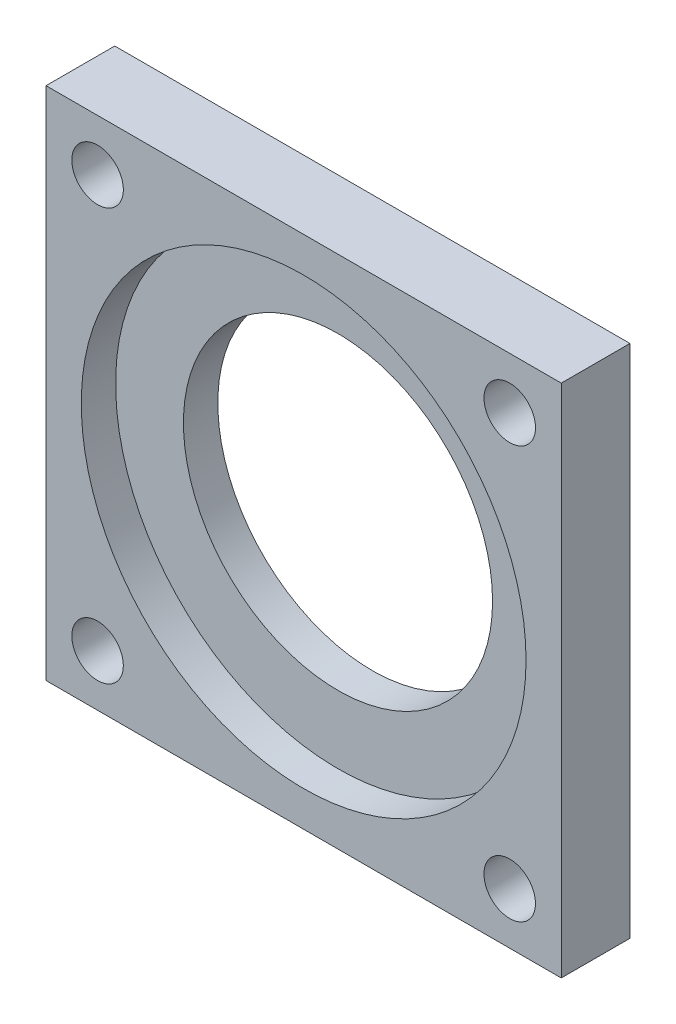
ISO-10303-21;
HEADER;
FILE_DESCRIPTION(('STEP AP214'),'2;1');
FILE_NAME('part.step','',(''),(''),'','','');
FILE_SCHEMA(('AUTOMOTIVE_DESIGN { 1 0 10303 214 1 1 1 1 }'));
ENDSEC;
DATA;
#1=APPLICATION_CONTEXT('core data for automotive mechanical design processes');
#2=APPLICATION_PROTOCOL_DEFINITION('international standard','automotive_design',2000,#1);
#3=PRODUCT_CONTEXT('',#1,'mechanical');
#4=PRODUCT('Part','Part','',(#3));
#5=PRODUCT_RELATED_PRODUCT_CATEGORY('part','',(#4));
#6=PRODUCT_DEFINITION_FORMATION('','',#4);
#7=PRODUCT_DEFINITION_CONTEXT('part definition',#1,'design');
#8=PRODUCT_DEFINITION('design','',#6,#7);
#9=PRODUCT_DEFINITION_SHAPE('','',#8);
#10=(LENGTH_UNIT() NAMED_UNIT(*) SI_UNIT(.MILLI.,.METRE.));
#11=(NAMED_UNIT(*) PLANE_ANGLE_UNIT() SI_UNIT($,.RADIAN.));
#12=(NAMED_UNIT(*) SI_UNIT($,.STERADIAN.) SOLID_ANGLE_UNIT());
#13=UNCERTAINTY_MEASURE_WITH_UNIT(LENGTH_MEASURE(1.E-05),#10,'distance_accuracy_value','');
#14=(GEOMETRIC_REPRESENTATION_CONTEXT(3) GLOBAL_UNCERTAINTY_ASSIGNED_CONTEXT((#13)) GLOBAL_UNIT_ASSIGNED_CONTEXT((#10,
#11,#12)) REPRESENTATION_CONTEXT('',''));
#15=CARTESIAN_POINT('',(0.,0.,0.));
#16=DIRECTION('',(0.,0.,1.));
#17=DIRECTION('',(1.,0.,0.));
#18=AXIS2_PLACEMENT_3D('',#15,#16,#17);
#19=CARTESIAN_POINT('',(0.,0.,-0.00100000000000013));
#20=DIRECTION('',(0.,0.,1.));
#21=DIRECTION('',(1.,0.,0.));
#22=AXIS2_PLACEMENT_3D('',#19,#20,#21);
#23=CYLINDRICAL_SURFACE('',#22,9.);
#24=CARTESIAN_POINT('',(0.,0.,0.));
#25=DIRECTION('',(0.,0.,1.));
#26=DIRECTION('',(1.,0.,0.));
#27=AXIS2_PLACEMENT_3D('',#24,#25,#26);
#28=CIRCLE('',#27,9.);
#29=CARTESIAN_POINT('',(9.,0.,0.));
#30=VERTEX_POINT('',#29);
#31=EDGE_CURVE('E135',#30,#30,#28,.F.);
#32=ORIENTED_EDGE('',*,*,#31,.T.);
#33=EDGE_LOOP('',(#32));
#34=FACE_BOUND('',#33,.T.);
#35=CARTESIAN_POINT('',(0.,0.,2.));
#36=DIRECTION('',(0.,0.,1.));
#37=DIRECTION('',(1.,0.,0.));
#38=AXIS2_PLACEMENT_3D('',#35,#36,#37);
#39=CIRCLE('',#38,9.);
#40=CARTESIAN_POINT('',(9.,0.,2.));
#41=VERTEX_POINT('',#40);
#42=EDGE_CURVE('E36',#41,#41,#39,.F.);
#43=ORIENTED_EDGE('',*,*,#42,.F.);
#44=EDGE_LOOP('',(#43));
#45=FACE_BOUND('',#44,.T.);
#46=ADVANCED_FACE('F32',(#34,#45),#23,.F.);
#47=CARTESIAN_POINT('',(-15.,-15.,4.));
#48=DIRECTION('',(0.,0.,1.));
#49=DIRECTION('',(1.,0.,0.));
#50=AXIS2_PLACEMENT_3D('',#47,#48,#49);
#51=PLANE('',#50);
#52=CARTESIAN_POINT('',(0.,0.,4.));
#53=DIRECTION('',(0.,0.,1.));
#54=DIRECTION('',(1.,0.,0.));
#55=AXIS2_PLACEMENT_3D('',#52,#53,#54);
#56=CIRCLE('',#55,12.95);
#57=CARTESIAN_POINT('',(12.95,0.,4.));
#58=VERTEX_POINT('',#57);
#59=EDGE_CURVE('E140',#58,#58,#56,.T.);
#60=ORIENTED_EDGE('',*,*,#59,.F.);
#61=EDGE_LOOP('',(#60));
#62=FACE_BOUND('',#61,.T.);
#63=CARTESIAN_POINT('',(12.,12.,4.));
#64=DIRECTION('',(0.,0.,1.));
#65=DIRECTION('',(1.,0.,0.));
#66=AXIS2_PLACEMENT_3D('',#63,#64,#65);
#67=CIRCLE('',#66,1.5);
#68=CARTESIAN_POINT('',(13.5,12.,4.));
#69=VERTEX_POINT('',#68);
#70=EDGE_CURVE('E123',#69,#69,#67,.T.);
#71=ORIENTED_EDGE('',*,*,#70,.F.);
#72=EDGE_LOOP('',(#71));
#73=FACE_BOUND('',#72,.T.);
#74=CARTESIAN_POINT('',(-12.,-12.,4.));
#75=DIRECTION('',(0.,0.,1.));
#76=DIRECTION('',(1.,0.,0.));
#77=AXIS2_PLACEMENT_3D('',#74,#75,#76);
#78=CIRCLE('',#77,1.5);
#79=CARTESIAN_POINT('',(-10.5,-12.,4.));
#80=VERTEX_POINT('',#79);
#81=EDGE_CURVE('E102',#80,#80,#78,.T.);
#82=ORIENTED_EDGE('',*,*,#81,.F.);
#83=EDGE_LOOP('',(#82));
#84=FACE_BOUND('',#83,.T.);
#85=DIRECTION('',(0.,-1.,0.));
#86=VECTOR('',#85,1.);
#87=CARTESIAN_POINT('',(-15.,15.,4.));
#88=LINE('',#87,#86);
#89=CARTESIAN_POINT('',(-15.,15.,4.));
#90=VERTEX_POINT('',#89);
#91=CARTESIAN_POINT('',(-15.,-15.,4.));
#92=VERTEX_POINT('',#91);
#93=EDGE_CURVE('E86',#90,#92,#88,.T.);
#94=ORIENTED_EDGE('',*,*,#93,.T.);
#95=DIRECTION('',(1.,0.,0.));
#96=VECTOR('',#95,1.);
#97=CARTESIAN_POINT('',(-15.,-15.,4.));
#98=LINE('',#97,#96);
#99=CARTESIAN_POINT('',(15.,-15.,4.));
#100=VERTEX_POINT('',#99);
#101=EDGE_CURVE('E80',#92,#100,#98,.T.);
#102=ORIENTED_EDGE('',*,*,#101,.T.);
#103=DIRECTION('',(0.,1.,0.));
#104=VECTOR('',#103,1.);
#105=CARTESIAN_POINT('',(15.,15.,4.));
#106=LINE('',#105,#104);
#107=CARTESIAN_POINT('',(15.,15.,4.));
#108=VERTEX_POINT('',#107);
#109=EDGE_CURVE('E84',#100,#108,#106,.T.);
#110=ORIENTED_EDGE('',*,*,#109,.T.);
#111=DIRECTION('',(-1.,0.,0.));
#112=VECTOR('',#111,1.);
#113=CARTESIAN_POINT('',(-15.,15.,4.));
#114=LINE('',#113,#112);
#115=EDGE_CURVE('E50',#108,#90,#114,.T.);
#116=ORIENTED_EDGE('',*,*,#115,.T.);
#117=EDGE_LOOP('',(#94,#102,#110,#116));
#118=FACE_BOUND('',#117,.T.);
#119=CARTESIAN_POINT('',(12.,-12.,4.));
#120=DIRECTION('',(0.,0.,1.));
#121=DIRECTION('',(-1.,0.,0.));
#122=AXIS2_PLACEMENT_3D('',#119,#120,#121);
#123=CIRCLE('',#122,1.5);
#124=CARTESIAN_POINT('',(10.5,-12.,4.));
#125=VERTEX_POINT('',#124);
#126=EDGE_CURVE('E117',#125,#125,#123,.T.);
#127=ORIENTED_EDGE('',*,*,#126,.F.);
#128=EDGE_LOOP('',(#127));
#129=FACE_BOUND('',#128,.T.);
#130=CARTESIAN_POINT('',(-12.,12.,4.));
#131=DIRECTION('',(0.,0.,1.));
#132=DIRECTION('',(-1.,0.,0.));
#133=AXIS2_PLACEMENT_3D('',#130,#131,#132);
#134=CIRCLE('',#133,1.5);
#135=CARTESIAN_POINT('',(-13.5,12.,4.));
#136=VERTEX_POINT('',#135);
#137=EDGE_CURVE('E129',#136,#136,#134,.T.);
#138=ORIENTED_EDGE('',*,*,#137,.F.);
#139=EDGE_LOOP('',(#138));
#140=FACE_BOUND('',#139,.T.);
#141=ADVANCED_FACE('F81',(#62,#73,#84,#118,#129,#140),#51,.T.);
#142=CARTESIAN_POINT('',(-15.,-15.,0.));
#143=DIRECTION('',(0.,0.,1.));
#144=DIRECTION('',(1.,0.,0.));
#145=AXIS2_PLACEMENT_3D('',#142,#143,#144);
#146=PLANE('',#145);
#147=ORIENTED_EDGE('',*,*,#31,.F.);
#148=EDGE_LOOP('',(#147));
#149=FACE_BOUND('',#148,.T.);
#150=CARTESIAN_POINT('',(12.,12.,0.));
#151=DIRECTION('',(0.,0.,1.));
#152=DIRECTION('',(1.,0.,0.));
#153=AXIS2_PLACEMENT_3D('',#150,#151,#152);
#154=CIRCLE('',#153,1.5);
#155=CARTESIAN_POINT('',(13.5,12.,0.));
#156=VERTEX_POINT('',#155);
#157=EDGE_CURVE('E126',#156,#156,#154,.T.);
#158=ORIENTED_EDGE('',*,*,#157,.T.);
#159=EDGE_LOOP('',(#158));
#160=FACE_BOUND('',#159,.T.);
#161=CARTESIAN_POINT('',(-12.,-12.,0.));
#162=DIRECTION('',(0.,0.,1.));
#163=DIRECTION('',(1.,0.,0.));
#164=AXIS2_PLACEMENT_3D('',#161,#162,#163);
#165=CIRCLE('',#164,1.5);
#166=CARTESIAN_POINT('',(-10.5,-12.,0.));
#167=VERTEX_POINT('',#166);
#168=EDGE_CURVE('E114',#167,#167,#165,.T.);
#169=ORIENTED_EDGE('',*,*,#168,.T.);
#170=EDGE_LOOP('',(#169));
#171=FACE_BOUND('',#170,.T.);
#172=DIRECTION('',(0.,-1.,0.));
#173=VECTOR('',#172,1.);
#174=CARTESIAN_POINT('',(-15.,15.,0.));
#175=LINE('',#174,#173);
#176=CARTESIAN_POINT('',(-15.,15.,0.));
#177=VERTEX_POINT('',#176);
#178=CARTESIAN_POINT('',(-15.,-15.,0.));
#179=VERTEX_POINT('',#178);
#180=EDGE_CURVE('E99',#177,#179,#175,.T.);
#181=ORIENTED_EDGE('',*,*,#180,.F.);
#182=DIRECTION('',(-1.,0.,0.));
#183=VECTOR('',#182,1.);
#184=CARTESIAN_POINT('',(-15.,15.,0.));
#185=LINE('',#184,#183);
#186=CARTESIAN_POINT('',(15.,15.,0.));
#187=VERTEX_POINT('',#186);
#188=EDGE_CURVE('E73',#187,#177,#185,.T.);
#189=ORIENTED_EDGE('',*,*,#188,.F.);
#190=DIRECTION('',(0.,1.,0.));
#191=VECTOR('',#190,1.);
#192=CARTESIAN_POINT('',(15.,15.,0.));
#193=LINE('',#192,#191);
#194=CARTESIAN_POINT('',(15.,-15.,0.));
#195=VERTEX_POINT('',#194);
#196=EDGE_CURVE('E67',#195,#187,#193,.T.);
#197=ORIENTED_EDGE('',*,*,#196,.F.);
#198=DIRECTION('',(1.,0.,0.));
#199=VECTOR('',#198,1.);
#200=CARTESIAN_POINT('',(-15.,-15.,0.));
#201=LINE('',#200,#199);
#202=EDGE_CURVE('E90',#179,#195,#201,.T.);
#203=ORIENTED_EDGE('',*,*,#202,.F.);
#204=EDGE_LOOP('',(#181,#189,#197,#203));
#205=FACE_BOUND('',#204,.T.);
#206=CARTESIAN_POINT('',(12.,-12.,0.));
#207=DIRECTION('',(0.,0.,1.));
#208=DIRECTION('',(-1.,0.,0.));
#209=AXIS2_PLACEMENT_3D('',#206,#207,#208);
#210=CIRCLE('',#209,1.5);
#211=CARTESIAN_POINT('',(10.5,-12.,0.));
#212=VERTEX_POINT('',#211);
#213=EDGE_CURVE('E120',#212,#212,#210,.T.);
#214=ORIENTED_EDGE('',*,*,#213,.T.);
#215=EDGE_LOOP('',(#214));
#216=FACE_BOUND('',#215,.T.);
#217=CARTESIAN_POINT('',(-12.,12.,0.));
#218=DIRECTION('',(0.,0.,1.));
#219=DIRECTION('',(-1.,0.,0.));
#220=AXIS2_PLACEMENT_3D('',#217,#218,#219);
#221=CIRCLE('',#220,1.5);
#222=CARTESIAN_POINT('',(-13.5,12.,0.));
#223=VERTEX_POINT('',#222);
#224=EDGE_CURVE('E132',#223,#223,#221,.T.);
#225=ORIENTED_EDGE('',*,*,#224,.T.);
#226=EDGE_LOOP('',(#225));
#227=FACE_BOUND('',#226,.T.);
#228=ADVANCED_FACE('F110',(#149,#160,#171,#205,#216,#227),#146,.F.);
#229=CARTESIAN_POINT('',(-15.,15.,4.));
#230=DIRECTION('',(1.,0.,0.));
#231=DIRECTION('',(0.,1.,0.));
#232=AXIS2_PLACEMENT_3D('',#229,#230,#231);
#233=PLANE('',#232);
#234=ORIENTED_EDGE('',*,*,#180,.T.);
#235=DIRECTION('',(0.,0.,-1.));
#236=VECTOR('',#235,1.);
#237=CARTESIAN_POINT('',(-15.,-15.,4.));
#238=LINE('',#237,#236);
#239=EDGE_CURVE('E11',#92,#179,#238,.T.);
#240=ORIENTED_EDGE('',*,*,#239,.F.);
#241=ORIENTED_EDGE('',*,*,#93,.F.);
#242=DIRECTION('',(0.,0.,-1.));
#243=VECTOR('',#242,1.);
#244=CARTESIAN_POINT('',(-15.,15.,4.));
#245=LINE('',#244,#243);
#246=EDGE_CURVE('E95',#90,#177,#245,.T.);
#247=ORIENTED_EDGE('',*,*,#246,.T.);
#248=EDGE_LOOP('',(#234,#240,#241,#247));
#249=FACE_BOUND('',#248,.T.);
#250=ADVANCED_FACE('F34',(#249),#233,.F.);
#251=CARTESIAN_POINT('',(-15.,-15.,4.));
#252=DIRECTION('',(0.,1.,0.));
#253=DIRECTION('',(0.,0.,1.));
#254=AXIS2_PLACEMENT_3D('',#251,#252,#253);
#255=PLANE('',#254);
#256=ORIENTED_EDGE('',*,*,#202,.T.);
#257=DIRECTION('',(0.,0.,-1.));
#258=VECTOR('',#257,1.);
#259=CARTESIAN_POINT('',(15.,-15.,4.));
#260=LINE('',#259,#258);
#261=EDGE_CURVE('E42',#100,#195,#260,.T.);
#262=ORIENTED_EDGE('',*,*,#261,.F.);
#263=ORIENTED_EDGE('',*,*,#101,.F.);
#264=ORIENTED_EDGE('',*,*,#239,.T.);
#265=EDGE_LOOP('',(#256,#262,#263,#264));
#266=FACE_BOUND('',#265,.T.);
#267=ADVANCED_FACE('F89',(#266),#255,.F.);
#268=CARTESIAN_POINT('',(15.,15.,4.));
#269=DIRECTION('',(-1.,0.,0.));
#270=DIRECTION('',(0.,0.,1.));
#271=AXIS2_PLACEMENT_3D('',#268,#269,#270);
#272=PLANE('',#271);
#273=ORIENTED_EDGE('',*,*,#196,.T.);
#274=DIRECTION('',(0.,0.,-1.));
#275=VECTOR('',#274,1.);
#276=CARTESIAN_POINT('',(15.,15.,4.));
#277=LINE('',#276,#275);
#278=EDGE_CURVE('E91',#108,#187,#277,.T.);
#279=ORIENTED_EDGE('',*,*,#278,.F.);
#280=ORIENTED_EDGE('',*,*,#109,.F.);
#281=ORIENTED_EDGE('',*,*,#261,.T.);
#282=EDGE_LOOP('',(#273,#279,#280,#281));
#283=FACE_BOUND('',#282,.T.);
#284=ADVANCED_FACE('F93',(#283),#272,.F.);
#285=CARTESIAN_POINT('',(-15.,15.,4.));
#286=DIRECTION('',(0.,-1.,0.));
#287=DIRECTION('',(0.,0.,-1.));
#288=AXIS2_PLACEMENT_3D('',#285,#286,#287);
#289=PLANE('',#288);
#290=ORIENTED_EDGE('',*,*,#188,.T.);
#291=ORIENTED_EDGE('',*,*,#246,.F.);
#292=ORIENTED_EDGE('',*,*,#115,.F.);
#293=ORIENTED_EDGE('',*,*,#278,.T.);
#294=EDGE_LOOP('',(#290,#291,#292,#293));
#295=FACE_BOUND('',#294,.T.);
#296=ADVANCED_FACE('F107',(#295),#289,.F.);
#297=CARTESIAN_POINT('',(-12.,-12.,4.));
#298=DIRECTION('',(0.,0.,-1.));
#299=DIRECTION('',(-1.,0.,0.));
#300=AXIS2_PLACEMENT_3D('',#297,#298,#299);
#301=CYLINDRICAL_SURFACE('',#300,1.5);
#302=ORIENTED_EDGE('',*,*,#81,.T.);
#303=EDGE_LOOP('',(#302));
#304=FACE_BOUND('',#303,.T.);
#305=ORIENTED_EDGE('',*,*,#168,.F.);
#306=EDGE_LOOP('',(#305));
#307=FACE_BOUND('',#306,.T.);
#308=ADVANCED_FACE('F175',(#304,#307),#301,.F.);
#309=CARTESIAN_POINT('',(12.,-12.,4.));
#310=DIRECTION('',(0.,0.,-1.));
#311=DIRECTION('',(-1.,0.,0.));
#312=AXIS2_PLACEMENT_3D('',#309,#310,#311);
#313=CYLINDRICAL_SURFACE('',#312,1.5);
#314=ORIENTED_EDGE('',*,*,#126,.T.);
#315=EDGE_LOOP('',(#314));
#316=FACE_BOUND('',#315,.T.);
#317=ORIENTED_EDGE('',*,*,#213,.F.);
#318=EDGE_LOOP('',(#317));
#319=FACE_BOUND('',#318,.T.);
#320=ADVANCED_FACE('F171',(#316,#319),#313,.F.);
#321=CARTESIAN_POINT('',(12.,12.,4.));
#322=DIRECTION('',(0.,0.,-1.));
#323=DIRECTION('',(-1.,0.,0.));
#324=AXIS2_PLACEMENT_3D('',#321,#322,#323);
#325=CYLINDRICAL_SURFACE('',#324,1.5);
#326=ORIENTED_EDGE('',*,*,#70,.T.);
#327=EDGE_LOOP('',(#326));
#328=FACE_BOUND('',#327,.T.);
#329=ORIENTED_EDGE('',*,*,#157,.F.);
#330=EDGE_LOOP('',(#329));
#331=FACE_BOUND('',#330,.T.);
#332=ADVANCED_FACE('F167',(#328,#331),#325,.F.);
#333=CARTESIAN_POINT('',(-12.,12.,4.));
#334=DIRECTION('',(0.,0.,-1.));
#335=DIRECTION('',(-1.,0.,0.));
#336=AXIS2_PLACEMENT_3D('',#333,#334,#335);
#337=CYLINDRICAL_SURFACE('',#336,1.5);
#338=ORIENTED_EDGE('',*,*,#137,.T.);
#339=EDGE_LOOP('',(#338));
#340=FACE_BOUND('',#339,.T.);
#341=ORIENTED_EDGE('',*,*,#224,.F.);
#342=EDGE_LOOP('',(#341));
#343=FACE_BOUND('',#342,.T.);
#344=ADVANCED_FACE('F164',(#340,#343),#337,.F.);
#345=CARTESIAN_POINT('',(0.,0.,2.));
#346=DIRECTION('',(0.,0.,1.));
#347=DIRECTION('',(1.,0.,0.));
#348=AXIS2_PLACEMENT_3D('',#345,#346,#347);
#349=PLANE('',#348);
#350=CARTESIAN_POINT('',(0.,0.,2.));
#351=DIRECTION('',(0.,0.,1.));
#352=DIRECTION('',(1.,0.,0.));
#353=AXIS2_PLACEMENT_3D('',#350,#351,#352);
#354=CIRCLE('',#353,12.95);
#355=CARTESIAN_POINT('',(12.95,0.,2.));
#356=VERTEX_POINT('',#355);
#357=EDGE_CURVE('E143',#356,#356,#354,.T.);
#358=ORIENTED_EDGE('',*,*,#357,.T.);
#359=EDGE_LOOP('',(#358));
#360=FACE_BOUND('',#359,.T.);
#361=ORIENTED_EDGE('',*,*,#42,.T.);
#362=EDGE_LOOP('',(#361));
#363=FACE_BOUND('',#362,.T.);
#364=ADVANCED_FACE('F150',(#360,#363),#349,.T.);
#365=CARTESIAN_POINT('',(0.,0.,2.));
#366=DIRECTION('',(0.,0.,1.));
#367=DIRECTION('',(1.,0.,0.));
#368=AXIS2_PLACEMENT_3D('',#365,#366,#367);
#369=CYLINDRICAL_SURFACE('',#368,12.95);
#370=ORIENTED_EDGE('',*,*,#357,.F.);
#371=EDGE_LOOP('',(#370));
#372=FACE_BOUND('',#371,.T.);
#373=ORIENTED_EDGE('',*,*,#59,.T.);
#374=EDGE_LOOP('',(#373));
#375=FACE_BOUND('',#374,.T.);
#376=ADVANCED_FACE('F162',(#372,#375),#369,.F.);
#377=CLOSED_SHELL('',(#46,#141,#228,#250,#267,#284,#296,#308,#320,#332,#344,#364,#376));
#378=MANIFOLD_SOLID_BREP('B2',#377);
#379=ADVANCED_BREP_SHAPE_REPRESENTATION('',(#18,#378),#14);
#380=SHAPE_DEFINITION_REPRESENTATION(#9,#379);
ENDSEC;
END-ISO-10303-21;
